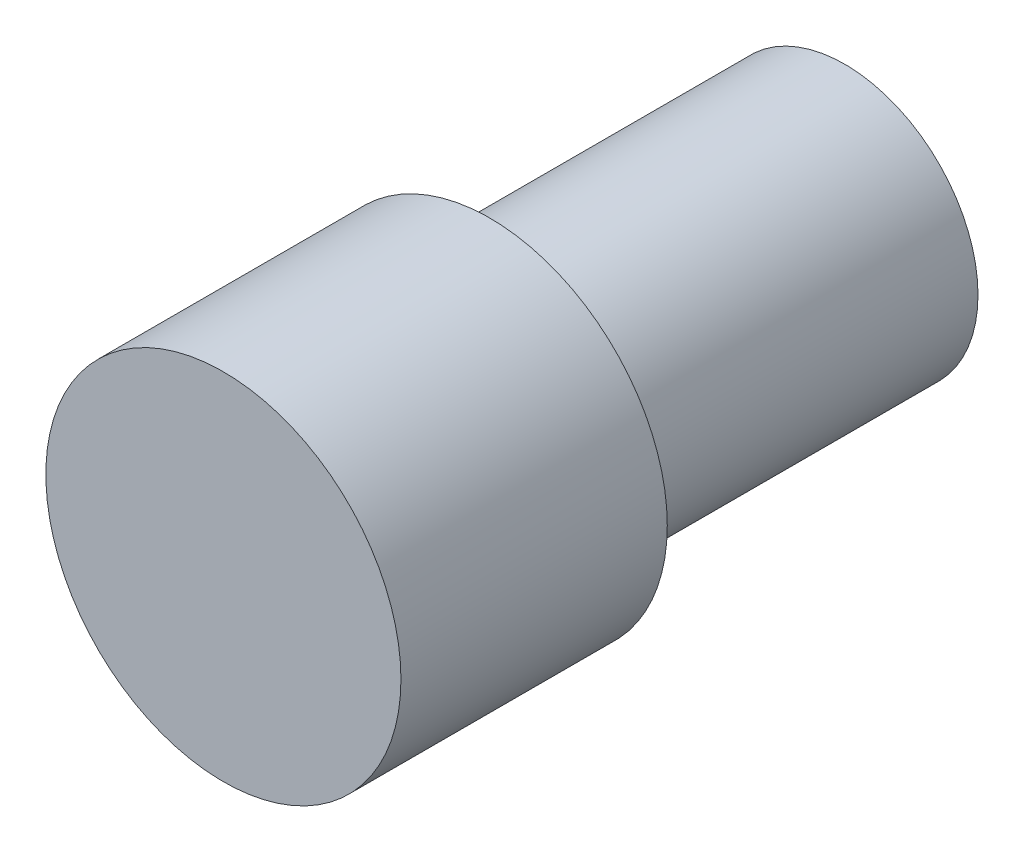
ISO-10303-21;
HEADER;
FILE_DESCRIPTION(('STEP AP214'),'2;1');
FILE_NAME('part.step','',(''),(''),'','','');
FILE_SCHEMA(('AUTOMOTIVE_DESIGN { 1 0 10303 214 1 1 1 1 }'));
ENDSEC;
DATA;
#1=APPLICATION_CONTEXT('core data for automotive mechanical design processes');
#2=APPLICATION_PROTOCOL_DEFINITION('international standard','automotive_design',2000,#1);
#3=PRODUCT_CONTEXT('',#1,'mechanical');
#4=PRODUCT('Part','Part','',(#3));
#5=PRODUCT_RELATED_PRODUCT_CATEGORY('part','',(#4));
#6=PRODUCT_DEFINITION_FORMATION('','',#4);
#7=PRODUCT_DEFINITION_CONTEXT('part definition',#1,'design');
#8=PRODUCT_DEFINITION('design','',#6,#7);
#9=PRODUCT_DEFINITION_SHAPE('','',#8);
#10=(LENGTH_UNIT() NAMED_UNIT(*) SI_UNIT(.MILLI.,.METRE.));
#11=(NAMED_UNIT(*) PLANE_ANGLE_UNIT() SI_UNIT($,.RADIAN.));
#12=(NAMED_UNIT(*) SI_UNIT($,.STERADIAN.) SOLID_ANGLE_UNIT());
#13=UNCERTAINTY_MEASURE_WITH_UNIT(LENGTH_MEASURE(1.E-05),#10,'distance_accuracy_value','');
#14=(GEOMETRIC_REPRESENTATION_CONTEXT(3) GLOBAL_UNCERTAINTY_ASSIGNED_CONTEXT((#13)) GLOBAL_UNIT_ASSIGNED_CONTEXT((#10,
#11,#12)) REPRESENTATION_CONTEXT('',''));
#15=CARTESIAN_POINT('',(0.,0.,0.));
#16=DIRECTION('',(0.,0.,1.));
#17=DIRECTION('',(1.,0.,0.));
#18=AXIS2_PLACEMENT_3D('',#15,#16,#17);
#19=CARTESIAN_POINT('',(0.,0.,3.));
#20=DIRECTION('',(0.,0.,-1.));
#21=DIRECTION('',(-1.,0.,0.));
#22=AXIS2_PLACEMENT_3D('',#19,#20,#21);
#23=CYLINDRICAL_SURFACE('',#22,2.);
#24=CARTESIAN_POINT('',(0.,0.,3.));
#25=DIRECTION('',(0.,0.,1.));
#26=DIRECTION('',(1.,0.,0.));
#27=AXIS2_PLACEMENT_3D('',#24,#25,#26);
#28=CIRCLE('',#27,2.);
#29=CARTESIAN_POINT('',(2.,0.,3.));
#30=VERTEX_POINT('',#29);
#31=EDGE_CURVE('E10',#30,#30,#28,.T.);
#32=ORIENTED_EDGE('',*,*,#31,.F.);
#33=EDGE_LOOP('',(#32));
#34=FACE_BOUND('',#33,.T.);
#35=CARTESIAN_POINT('',(0.,0.,0.));
#36=DIRECTION('',(0.,0.,1.));
#37=DIRECTION('',(1.,0.,0.));
#38=AXIS2_PLACEMENT_3D('',#35,#36,#37);
#39=CIRCLE('',#38,2.);
#40=CARTESIAN_POINT('',(2.,0.,0.));
#41=VERTEX_POINT('',#40);
#42=EDGE_CURVE('E40',#41,#41,#39,.T.);
#43=ORIENTED_EDGE('',*,*,#42,.T.);
#44=EDGE_LOOP('',(#43));
#45=FACE_BOUND('',#44,.T.);
#46=ADVANCED_FACE('F37',(#34,#45),#23,.T.);
#47=CARTESIAN_POINT('',(0.,0.,3.));
#48=DIRECTION('',(0.,0.,1.));
#49=DIRECTION('',(1.,0.,0.));
#50=AXIS2_PLACEMENT_3D('',#47,#48,#49);
#51=PLANE('',#50);
#52=ORIENTED_EDGE('',*,*,#31,.T.);
#53=EDGE_LOOP('',(#52));
#54=FACE_BOUND('',#53,.T.);
#55=ADVANCED_FACE('F67',(#54),#51,.T.);
#56=CARTESIAN_POINT('',(0.,0.,0.));
#57=DIRECTION('',(0.,0.,1.));
#58=DIRECTION('',(1.,0.,0.));
#59=AXIS2_PLACEMENT_3D('',#56,#57,#58);
#60=PLANE('',#59);
#61=CARTESIAN_POINT('',(0.,0.,0.));
#62=DIRECTION('',(0.,0.,1.));
#63=DIRECTION('',(1.,0.,0.));
#64=AXIS2_PLACEMENT_3D('',#61,#62,#63);
#65=CIRCLE('',#64,1.5);
#66=CARTESIAN_POINT('',(1.5,0.,0.));
#67=VERTEX_POINT('',#66);
#68=EDGE_CURVE('E49',#67,#67,#65,.T.);
#69=ORIENTED_EDGE('',*,*,#68,.T.);
#70=EDGE_LOOP('',(#69));
#71=FACE_BOUND('',#70,.T.);
#72=ORIENTED_EDGE('',*,*,#42,.F.);
#73=EDGE_LOOP('',(#72));
#74=FACE_BOUND('',#73,.T.);
#75=ADVANCED_FACE('F64',(#71,#74),#60,.F.);
#76=CARTESIAN_POINT('',(0.,0.,-4.));
#77=DIRECTION('',(0.,0.,1.));
#78=DIRECTION('',(1.,0.,0.));
#79=AXIS2_PLACEMENT_3D('',#76,#77,#78);
#80=CYLINDRICAL_SURFACE('',#79,1.5);
#81=CARTESIAN_POINT('',(0.,0.,-4.));
#82=DIRECTION('',(0.,0.,1.));
#83=DIRECTION('',(1.,0.,0.));
#84=AXIS2_PLACEMENT_3D('',#81,#82,#83);
#85=CIRCLE('',#84,1.5);
#86=CARTESIAN_POINT('',(1.5,0.,-4.));
#87=VERTEX_POINT('',#86);
#88=EDGE_CURVE('E47',#87,#87,#85,.T.);
#89=ORIENTED_EDGE('',*,*,#88,.T.);
#90=EDGE_LOOP('',(#89));
#91=FACE_BOUND('',#90,.T.);
#92=ORIENTED_EDGE('',*,*,#68,.F.);
#93=EDGE_LOOP('',(#92));
#94=FACE_BOUND('',#93,.T.);
#95=ADVANCED_FACE('F55',(#91,#94),#80,.T.);
#96=CARTESIAN_POINT('',(0.,0.,-4.));
#97=DIRECTION('',(0.,0.,1.));
#98=DIRECTION('',(1.,0.,0.));
#99=AXIS2_PLACEMENT_3D('',#96,#97,#98);
#100=PLANE('',#99);
#101=ORIENTED_EDGE('',*,*,#88,.F.);
#102=EDGE_LOOP('',(#101));
#103=FACE_BOUND('',#102,.T.);
#104=ADVANCED_FACE('F58',(#103),#100,.F.);
#105=CLOSED_SHELL('',(#46,#55,#75,#95,#104));
#106=MANIFOLD_SOLID_BREP('B2',#105);
#107=ADVANCED_BREP_SHAPE_REPRESENTATION('',(#18,#106),#14);
#108=SHAPE_DEFINITION_REPRESENTATION(#9,#107);
ENDSEC;
END-ISO-10303-21;
